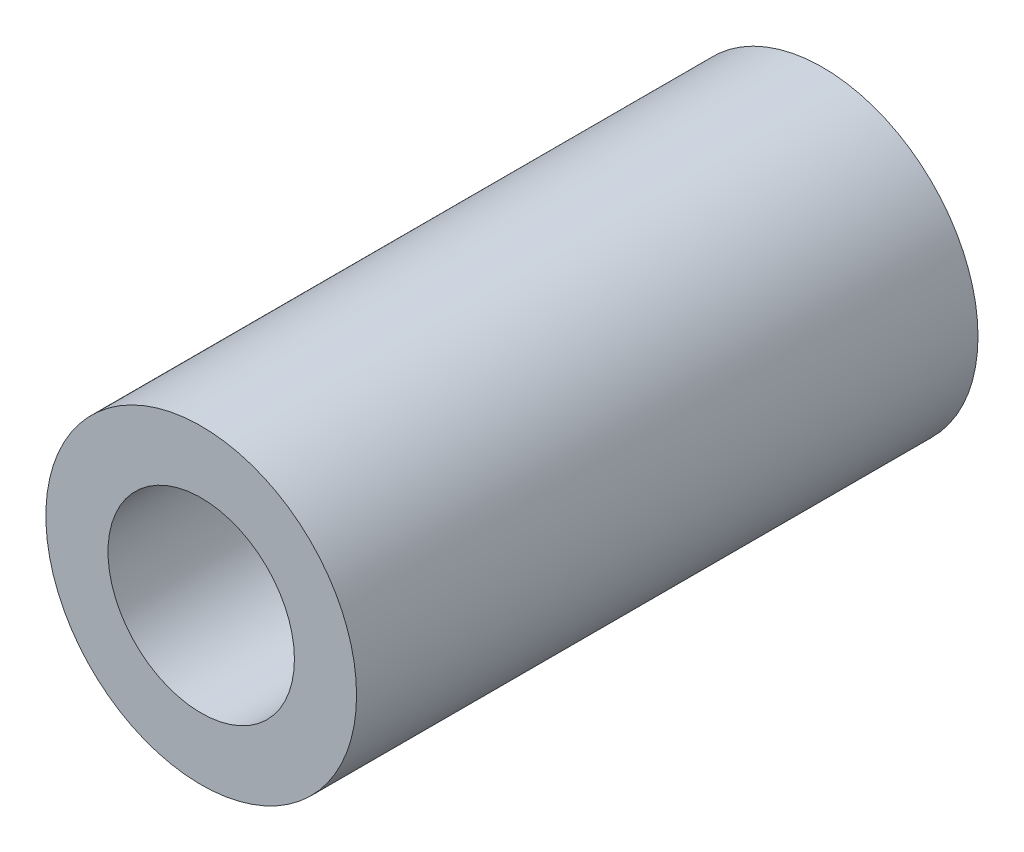
ISO-10303-21;
HEADER;
FILE_DESCRIPTION(('STEP AP214'),'2;1');
FILE_NAME('part.step','',(''),(''),'','','');
FILE_SCHEMA(('AUTOMOTIVE_DESIGN { 1 0 10303 214 1 1 1 1 }'));
ENDSEC;
DATA;
#1=APPLICATION_CONTEXT('core data for automotive mechanical design processes');
#2=APPLICATION_PROTOCOL_DEFINITION('international standard','automotive_design',2000,#1);
#3=PRODUCT_CONTEXT('',#1,'mechanical');
#4=PRODUCT('Part','Part','',(#3));
#5=PRODUCT_RELATED_PRODUCT_CATEGORY('part','',(#4));
#6=PRODUCT_DEFINITION_FORMATION('','',#4);
#7=PRODUCT_DEFINITION_CONTEXT('part definition',#1,'design');
#8=PRODUCT_DEFINITION('design','',#6,#7);
#9=PRODUCT_DEFINITION_SHAPE('','',#8);
#10=(LENGTH_UNIT() NAMED_UNIT(*) SI_UNIT(.MILLI.,.METRE.));
#11=(NAMED_UNIT(*) PLANE_ANGLE_UNIT() SI_UNIT($,.RADIAN.));
#12=(NAMED_UNIT(*) SI_UNIT($,.STERADIAN.) SOLID_ANGLE_UNIT());
#13=UNCERTAINTY_MEASURE_WITH_UNIT(LENGTH_MEASURE(1.E-05),#10,'distance_accuracy_value','');
#14=(GEOMETRIC_REPRESENTATION_CONTEXT(3) GLOBAL_UNCERTAINTY_ASSIGNED_CONTEXT((#13)) GLOBAL_UNIT_ASSIGNED_CONTEXT((#10,
#11,#12)) REPRESENTATION_CONTEXT('',''));
#15=CARTESIAN_POINT('',(0.,0.,0.));
#16=DIRECTION('',(0.,0.,1.));
#17=DIRECTION('',(1.,0.,0.));
#18=AXIS2_PLACEMENT_3D('',#15,#16,#17);
#19=CARTESIAN_POINT('',(0.,0.,10.));
#20=DIRECTION('',(0.,0.,1.));
#21=DIRECTION('',(1.,0.,0.));
#22=AXIS2_PLACEMENT_3D('',#19,#20,#21);
#23=PLANE('',#22);
#24=CARTESIAN_POINT('',(0.,0.,10.));
#25=DIRECTION('',(0.,0.,1.));
#26=DIRECTION('',(1.,0.,0.));
#27=AXIS2_PLACEMENT_3D('',#24,#25,#26);
#28=CIRCLE('',#27,2.5);
#29=CARTESIAN_POINT('',(2.5,0.,10.));
#30=VERTEX_POINT('',#29);
#31=EDGE_CURVE('E10',#30,#30,#28,.T.);
#32=ORIENTED_EDGE('',*,*,#31,.T.);
#33=EDGE_LOOP('',(#32));
#34=FACE_BOUND('',#33,.T.);
#35=CARTESIAN_POINT('',(0.,0.,10.));
#36=DIRECTION('',(0.,0.,1.));
#37=DIRECTION('',(1.,0.,0.));
#38=AXIS2_PLACEMENT_3D('',#35,#36,#37);
#39=CIRCLE('',#38,1.5);
#40=CARTESIAN_POINT('',(1.5,0.,10.));
#41=VERTEX_POINT('',#40);
#42=EDGE_CURVE('E44',#41,#41,#39,.T.);
#43=ORIENTED_EDGE('',*,*,#42,.F.);
#44=EDGE_LOOP('',(#43));
#45=FACE_BOUND('',#44,.T.);
#46=ADVANCED_FACE('F33',(#34,#45),#23,.T.);
#47=CARTESIAN_POINT('',(0.,0.,0.));
#48=DIRECTION('',(0.,0.,1.));
#49=DIRECTION('',(1.,0.,0.));
#50=AXIS2_PLACEMENT_3D('',#47,#48,#49);
#51=PLANE('',#50);
#52=CARTESIAN_POINT('',(0.,0.,0.));
#53=DIRECTION('',(0.,0.,1.));
#54=DIRECTION('',(1.,0.,0.));
#55=AXIS2_PLACEMENT_3D('',#52,#53,#54);
#56=CIRCLE('',#55,2.5);
#57=CARTESIAN_POINT('',(2.5,0.,0.));
#58=VERTEX_POINT('',#57);
#59=EDGE_CURVE('E37',#58,#58,#56,.T.);
#60=ORIENTED_EDGE('',*,*,#59,.F.);
#61=EDGE_LOOP('',(#60));
#62=FACE_BOUND('',#61,.T.);
#63=CARTESIAN_POINT('',(0.,0.,0.));
#64=DIRECTION('',(0.,0.,1.));
#65=DIRECTION('',(1.,0.,0.));
#66=AXIS2_PLACEMENT_3D('',#63,#64,#65);
#67=CIRCLE('',#66,1.5);
#68=CARTESIAN_POINT('',(1.5,0.,0.));
#69=VERTEX_POINT('',#68);
#70=EDGE_CURVE('E46',#69,#69,#67,.T.);
#71=ORIENTED_EDGE('',*,*,#70,.T.);
#72=EDGE_LOOP('',(#71));
#73=FACE_BOUND('',#72,.T.);
#74=ADVANCED_FACE('F56',(#62,#73),#51,.F.);
#75=CARTESIAN_POINT('',(0.,0.,10.));
#76=DIRECTION('',(0.,0.,-1.));
#77=DIRECTION('',(-1.,0.,0.));
#78=AXIS2_PLACEMENT_3D('',#75,#76,#77);
#79=CYLINDRICAL_SURFACE('',#78,2.5);
#80=ORIENTED_EDGE('',*,*,#31,.F.);
#81=EDGE_LOOP('',(#80));
#82=FACE_BOUND('',#81,.T.);
#83=ORIENTED_EDGE('',*,*,#59,.T.);
#84=EDGE_LOOP('',(#83));
#85=FACE_BOUND('',#84,.T.);
#86=ADVANCED_FACE('F35',(#82,#85),#79,.T.);
#87=CARTESIAN_POINT('',(0.,0.,10.));
#88=DIRECTION('',(0.,0.,-1.));
#89=DIRECTION('',(-1.,0.,0.));
#90=AXIS2_PLACEMENT_3D('',#87,#88,#89);
#91=CYLINDRICAL_SURFACE('',#90,1.5);
#92=ORIENTED_EDGE('',*,*,#42,.T.);
#93=EDGE_LOOP('',(#92));
#94=FACE_BOUND('',#93,.T.);
#95=ORIENTED_EDGE('',*,*,#70,.F.);
#96=EDGE_LOOP('',(#95));
#97=FACE_BOUND('',#96,.T.);
#98=ADVANCED_FACE('F52',(#94,#97),#91,.F.);
#99=CLOSED_SHELL('',(#46,#74,#86,#98));
#100=MANIFOLD_SOLID_BREP('B2',#99);
#101=ADVANCED_BREP_SHAPE_REPRESENTATION('',(#18,#100),#14);
#102=SHAPE_DEFINITION_REPRESENTATION(#9,#101);
ENDSEC;
END-ISO-10303-21;
